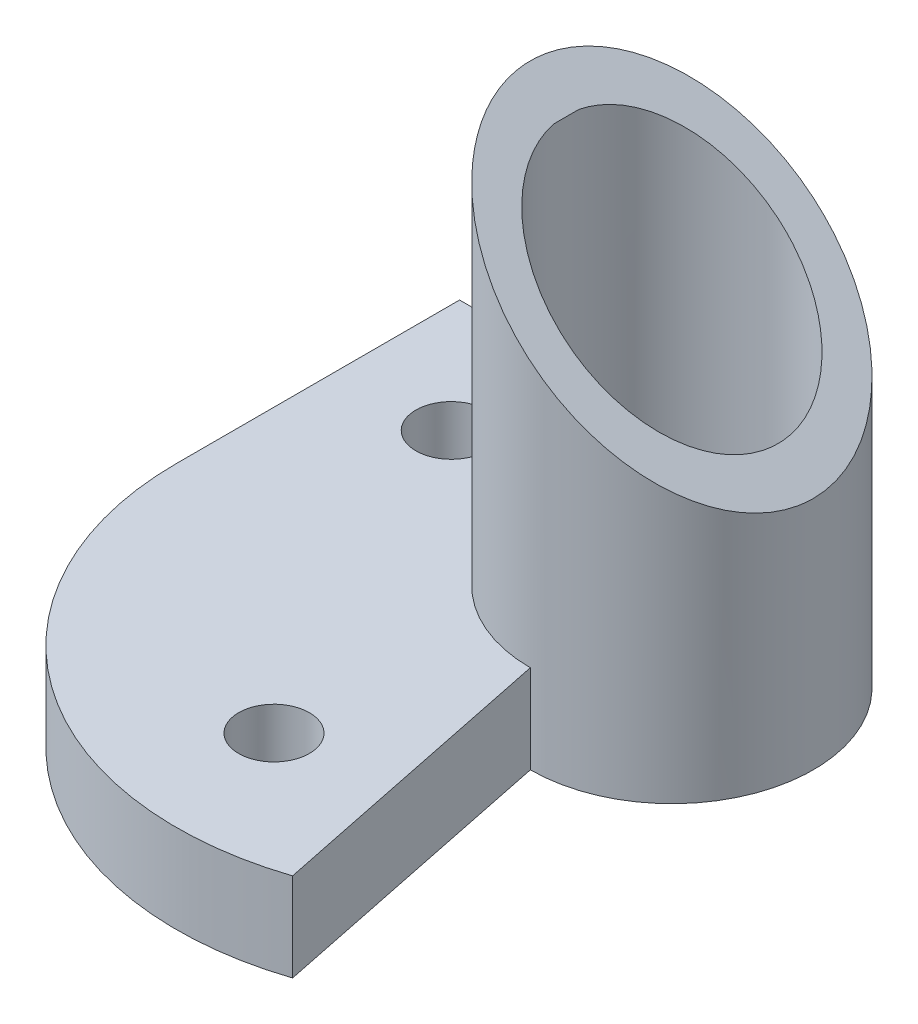
ISO-10303-21;
HEADER;
FILE_DESCRIPTION(('STEP AP214'),'2;1');
FILE_NAME('part.step','',(''),(''),'','','');
FILE_SCHEMA(('AUTOMOTIVE_DESIGN { 1 0 10303 214 1 1 1 1 }'));
ENDSEC;
DATA;
#1=APPLICATION_CONTEXT('core data for automotive mechanical design processes');
#2=APPLICATION_PROTOCOL_DEFINITION('international standard','automotive_design',2000,#1);
#3=PRODUCT_CONTEXT('',#1,'mechanical');
#4=PRODUCT('Part','Part','',(#3));
#5=PRODUCT_RELATED_PRODUCT_CATEGORY('part','',(#4));
#6=PRODUCT_DEFINITION_FORMATION('','',#4);
#7=PRODUCT_DEFINITION_CONTEXT('part definition',#1,'design');
#8=PRODUCT_DEFINITION('design','',#6,#7);
#9=PRODUCT_DEFINITION_SHAPE('','',#8);
#10=(LENGTH_UNIT() NAMED_UNIT(*) SI_UNIT(.MILLI.,.METRE.));
#11=(NAMED_UNIT(*) PLANE_ANGLE_UNIT() SI_UNIT($,.RADIAN.));
#12=(NAMED_UNIT(*) SI_UNIT($,.STERADIAN.) SOLID_ANGLE_UNIT());
#13=UNCERTAINTY_MEASURE_WITH_UNIT(LENGTH_MEASURE(1.E-05),#10,'distance_accuracy_value','');
#14=(GEOMETRIC_REPRESENTATION_CONTEXT(3) GLOBAL_UNCERTAINTY_ASSIGNED_CONTEXT((#13)) GLOBAL_UNIT_ASSIGNED_CONTEXT((#10,
#11,#12)) REPRESENTATION_CONTEXT('',''));
#15=CARTESIAN_POINT('',(0.,0.,0.));
#16=DIRECTION('',(0.,0.,1.));
#17=DIRECTION('',(1.,0.,0.));
#18=AXIS2_PLACEMENT_3D('',#15,#16,#17);
#19=CARTESIAN_POINT('',(0.,30.,0.));
#20=DIRECTION('',(0.,-1.,0.));
#21=DIRECTION('',(0.,0.,-1.));
#22=AXIS2_PLACEMENT_3D('',#19,#20,#21);
#23=CYLINDRICAL_SURFACE('',#22,8.);
#24=CARTESIAN_POINT('',(0.,0.,0.));
#25=DIRECTION('',(0.642787609686541,0.766044443118977,0.));
#26=DIRECTION('',(0.766044443118977,-0.64278760968654,0.));
#27=AXIS2_PLACEMENT_3D('',#24,#25,#26);
#28=ELLIPSE('',#27,10.4432583146582,8.);
#29=CARTESIAN_POINT('',(8.,-6.71279704941826,0.));
#30=VERTEX_POINT('',#29);
#31=EDGE_CURVE('E154',#30,#30,#28,.T.);
#32=ORIENTED_EDGE('',*,*,#31,.F.);
#33=EDGE_LOOP('',(#32));
#34=FACE_BOUND('',#33,.T.);
#35=DIRECTION('',(0.,-1.,0.));
#36=VECTOR('',#35,1.);
#37=CARTESIAN_POINT('',(0.,-15.,-8.));
#38=LINE('',#37,#36);
#39=CARTESIAN_POINT('',(0.,-15.,-8.));
#40=VERTEX_POINT('',#39);
#41=CARTESIAN_POINT('',(0.,-20.,-8.));
#42=VERTEX_POINT('',#41);
#43=EDGE_CURVE('E54',#40,#42,#38,.T.);
#44=ORIENTED_EDGE('',*,*,#43,.F.);
#45=CARTESIAN_POINT('',(0.,-15.,0.));
#46=DIRECTION('',(0.,-1.,0.));
#47=DIRECTION('',(0.,0.,-1.));
#48=AXIS2_PLACEMENT_3D('',#45,#46,#47);
#49=CIRCLE('',#48,8.);
#50=CARTESIAN_POINT('',(0.,-15.,8.));
#51=VERTEX_POINT('',#50);
#52=EDGE_CURVE('E59',#51,#40,#49,.T.);
#53=ORIENTED_EDGE('',*,*,#52,.F.);
#54=DIRECTION('',(0.,-1.,0.));
#55=VECTOR('',#54,1.);
#56=CARTESIAN_POINT('',(0.,-15.,8.));
#57=LINE('',#56,#55);
#58=CARTESIAN_POINT('',(0.,-20.,8.));
#59=VERTEX_POINT('',#58);
#60=EDGE_CURVE('E112',#51,#59,#57,.T.);
#61=ORIENTED_EDGE('',*,*,#60,.T.);
#62=CARTESIAN_POINT('',(0.,-20.,0.));
#63=DIRECTION('',(0.,1.,0.));
#64=DIRECTION('',(0.,0.,1.));
#65=AXIS2_PLACEMENT_3D('',#62,#63,#64);
#66=CIRCLE('',#65,8.);
#67=EDGE_CURVE('E152',#59,#42,#66,.T.);
#68=ORIENTED_EDGE('',*,*,#67,.T.);
#69=EDGE_LOOP('',(#44,#53,#61,#68));
#70=FACE_BOUND('',#69,.T.);
#71=ADVANCED_FACE('F40',(#34,#70),#23,.T.);
#72=CARTESIAN_POINT('',(0.,0.,0.));
#73=DIRECTION('',(0.642787609686541,0.766044443118977,0.));
#74=DIRECTION('',(-0.766044443118977,0.64278760968654,0.));
#75=AXIS2_PLACEMENT_3D('',#72,#73,#74);
#76=PLANE('',#75);
#77=ORIENTED_EDGE('',*,*,#31,.T.);
#78=EDGE_LOOP('',(#77));
#79=FACE_BOUND('',#78,.T.);
#80=CARTESIAN_POINT('',(0.,0.,0.));
#81=DIRECTION('',(0.642787609686541,0.766044443118977,0.));
#82=DIRECTION('',(0.766044443118977,-0.64278760968654,0.));
#83=AXIS2_PLACEMENT_3D('',#80,#81,#82);
#84=ELLIPSE('',#83,7.83244373599368,6.);
#85=CARTESIAN_POINT('',(-5.95876796297101,4.99999999999998,0.702199660688006));
#86=VERTEX_POINT('',#85);
#87=CARTESIAN_POINT('',(-5.95876796297101,4.99999999999998,-0.702199660687965));
#88=VERTEX_POINT('',#87);
#89=EDGE_CURVE('E47',#86,#88,#84,.T.);
#90=ORIENTED_EDGE('',*,*,#89,.F.);
#91=DIRECTION('',(0.,0.,1.));
#92=VECTOR('',#91,1.);
#93=CARTESIAN_POINT('',(-5.95876796297101,4.99999999999998,0.));
#94=LINE('',#93,#92);
#95=EDGE_CURVE('E13',#88,#86,#94,.T.);
#96=ORIENTED_EDGE('',*,*,#95,.F.);
#97=EDGE_LOOP('',(#90,#96));
#98=FACE_BOUND('',#97,.T.);
#99=ADVANCED_FACE('F166',(#79,#98),#76,.T.);
#100=CARTESIAN_POINT('',(0.,-20.,0.));
#101=DIRECTION('',(0.,1.,0.));
#102=DIRECTION('',(0.,0.,1.));
#103=AXIS2_PLACEMENT_3D('',#100,#101,#102);
#104=PLANE('',#103);
#105=CARTESIAN_POINT('',(0.,-20.,0.));
#106=DIRECTION('',(0.,-1.,0.));
#107=DIRECTION('',(0.,0.,-1.));
#108=AXIS2_PLACEMENT_3D('',#105,#106,#107);
#109=CIRCLE('',#108,6.);
#110=CARTESIAN_POINT('',(0.,-20.,-6.));
#111=VERTEX_POINT('',#110);
#112=EDGE_CURVE('E149',#111,#111,#109,.T.);
#113=ORIENTED_EDGE('',*,*,#112,.F.);
#114=EDGE_LOOP('',(#113));
#115=FACE_BOUND('',#114,.T.);
#116=ORIENTED_EDGE('',*,*,#67,.F.);
#117=DIRECTION('',(-0.200934070603872,0.,-0.979604766868025));
#118=VECTOR('',#117,1.);
#119=CARTESIAN_POINT('',(-1.57468778711799,-20.,0.322996005835533));
#120=LINE('',#119,#118);
#121=CARTESIAN_POINT('',(3.46810253358465,-20.,24.9078830866085));
#122=VERTEX_POINT('',#121);
#123=EDGE_CURVE('E129',#122,#59,#120,.T.);
#124=ORIENTED_EDGE('',*,*,#123,.F.);
#125=CARTESIAN_POINT('',(-2.17520257975725,-20.,8.));
#126=DIRECTION('',(0.,-1.,0.));
#127=DIRECTION('',(0.,0.,-1.));
#128=AXIS2_PLACEMENT_3D('',#125,#126,#127);
#129=CIRCLE('',#128,17.8247974202427);
#130=CARTESIAN_POINT('',(-20.,-20.,8.));
#131=VERTEX_POINT('',#130);
#132=EDGE_CURVE('E107',#131,#122,#129,.F.);
#133=ORIENTED_EDGE('',*,*,#132,.F.);
#134=DIRECTION('',(0.,0.,-1.));
#135=VECTOR('',#134,1.);
#136=CARTESIAN_POINT('',(-20.,-20.,0.));
#137=LINE('',#136,#135);
#138=CARTESIAN_POINT('',(-20.,-20.,-8.));
#139=VERTEX_POINT('',#138);
#140=EDGE_CURVE('E132',#131,#139,#137,.T.);
#141=ORIENTED_EDGE('',*,*,#140,.T.);
#142=DIRECTION('',(-1.,0.,0.));
#143=VECTOR('',#142,1.);
#144=CARTESIAN_POINT('',(0.,-20.,-8.));
#145=LINE('',#144,#143);
#146=EDGE_CURVE('E135',#42,#139,#145,.T.);
#147=ORIENTED_EDGE('',*,*,#146,.F.);
#148=EDGE_LOOP('',(#116,#124,#133,#141,#147));
#149=FACE_BOUND('',#148,.T.);
#150=CARTESIAN_POINT('',(-13.8510365706695,-20.,-1.37921930106953));
#151=DIRECTION('',(0.,-1.,0.));
#152=DIRECTION('',(0.,0.,-1.));
#153=AXIS2_PLACEMENT_3D('',#150,#151,#152);
#154=CIRCLE('',#153,2.);
#155=CARTESIAN_POINT('',(-13.8510365706695,-20.,-3.37921930106953));
#156=VERTEX_POINT('',#155);
#157=EDGE_CURVE('E126',#156,#156,#154,.T.);
#158=ORIENTED_EDGE('',*,*,#157,.F.);
#159=EDGE_LOOP('',(#158));
#160=FACE_BOUND('',#159,.T.);
#161=CARTESIAN_POINT('',(-4.04532645237533,-20.,18.4434255377461));
#162=DIRECTION('',(0.,-1.,0.));
#163=DIRECTION('',(0.,0.,-1.));
#164=AXIS2_PLACEMENT_3D('',#161,#162,#163);
#165=CIRCLE('',#164,2.);
#166=CARTESIAN_POINT('',(-4.04532645237533,-20.,16.4434255377461));
#167=VERTEX_POINT('',#166);
#168=EDGE_CURVE('E138',#167,#167,#165,.T.);
#169=ORIENTED_EDGE('',*,*,#168,.F.);
#170=EDGE_LOOP('',(#169));
#171=FACE_BOUND('',#170,.T.);
#172=ADVANCED_FACE('F168',(#115,#149,#160,#171),#104,.F.);
#173=CARTESIAN_POINT('',(0.,0.,0.));
#174=DIRECTION('',(0.,-1.,0.));
#175=DIRECTION('',(0.,0.,-1.));
#176=AXIS2_PLACEMENT_3D('',#173,#174,#175);
#177=CYLINDRICAL_SURFACE('',#176,6.);
#178=ORIENTED_EDGE('',*,*,#89,.T.);
#179=CARTESIAN_POINT('',(0.,4.99999999999998,0.));
#180=DIRECTION('',(0.,1.,0.));
#181=DIRECTION('',(0.,0.,1.));
#182=AXIS2_PLACEMENT_3D('',#179,#180,#181);
#183=CIRCLE('',#182,6.);
#184=EDGE_CURVE('E142',#88,#86,#183,.T.);
#185=ORIENTED_EDGE('',*,*,#184,.T.);
#186=EDGE_LOOP('',(#178,#185));
#187=FACE_BOUND('',#186,.T.);
#188=ORIENTED_EDGE('',*,*,#112,.T.);
#189=EDGE_LOOP('',(#188));
#190=FACE_BOUND('',#189,.T.);
#191=ADVANCED_FACE('F160',(#187,#190),#177,.F.);
#192=CARTESIAN_POINT('',(0.,4.99999999999998,0.));
#193=DIRECTION('',(0.,1.,0.));
#194=DIRECTION('',(0.,0.,1.));
#195=AXIS2_PLACEMENT_3D('',#192,#193,#194);
#196=PLANE('',#195);
#197=ORIENTED_EDGE('',*,*,#95,.T.);
#198=ORIENTED_EDGE('',*,*,#184,.F.);
#199=EDGE_LOOP('',(#197,#198));
#200=FACE_BOUND('',#199,.T.);
#201=ADVANCED_FACE('F165',(#200),#196,.F.);
#202=CARTESIAN_POINT('',(0.,-15.,-8.));
#203=DIRECTION('',(0.,0.,1.));
#204=DIRECTION('',(1.,0.,0.));
#205=AXIS2_PLACEMENT_3D('',#202,#203,#204);
#206=PLANE('',#205);
#207=ORIENTED_EDGE('',*,*,#146,.T.);
#208=DIRECTION('',(0.,-1.,0.));
#209=VECTOR('',#208,1.);
#210=CARTESIAN_POINT('',(-20.,-15.,-8.));
#211=LINE('',#210,#209);
#212=CARTESIAN_POINT('',(-20.,-15.,-8.));
#213=VERTEX_POINT('',#212);
#214=EDGE_CURVE('E143',#213,#139,#211,.T.);
#215=ORIENTED_EDGE('',*,*,#214,.F.);
#216=DIRECTION('',(-1.,0.,0.));
#217=VECTOR('',#216,1.);
#218=CARTESIAN_POINT('',(0.,-15.,-8.));
#219=LINE('',#218,#217);
#220=EDGE_CURVE('E121',#40,#213,#219,.T.);
#221=ORIENTED_EDGE('',*,*,#220,.F.);
#222=ORIENTED_EDGE('',*,*,#43,.T.);
#223=EDGE_LOOP('',(#207,#215,#221,#222));
#224=FACE_BOUND('',#223,.T.);
#225=ADVANCED_FACE('F182',(#224),#206,.F.);
#226=CARTESIAN_POINT('',(-20.,-15.,0.));
#227=DIRECTION('',(-1.,0.,0.));
#228=DIRECTION('',(0.,0.,1.));
#229=AXIS2_PLACEMENT_3D('',#226,#227,#228);
#230=PLANE('',#229);
#231=ORIENTED_EDGE('',*,*,#140,.F.);
#232=DIRECTION('',(0.,-1.,0.));
#233=VECTOR('',#232,1.);
#234=CARTESIAN_POINT('',(-20.,-15.,8.));
#235=LINE('',#234,#233);
#236=CARTESIAN_POINT('',(-20.,-15.,8.));
#237=VERTEX_POINT('',#236);
#238=EDGE_CURVE('E111',#237,#131,#235,.T.);
#239=ORIENTED_EDGE('',*,*,#238,.F.);
#240=DIRECTION('',(0.,0.,-1.));
#241=VECTOR('',#240,1.);
#242=CARTESIAN_POINT('',(-20.,-15.,0.));
#243=LINE('',#242,#241);
#244=EDGE_CURVE('E100',#237,#213,#243,.T.);
#245=ORIENTED_EDGE('',*,*,#244,.T.);
#246=ORIENTED_EDGE('',*,*,#214,.T.);
#247=EDGE_LOOP('',(#231,#239,#245,#246));
#248=FACE_BOUND('',#247,.T.);
#249=ADVANCED_FACE('F192',(#248),#230,.T.);
#250=CARTESIAN_POINT('',(-2.17520257975725,-15.,8.));
#251=DIRECTION('',(0.,-1.,0.));
#252=DIRECTION('',(0.,0.,-1.));
#253=AXIS2_PLACEMENT_3D('',#250,#251,#252);
#254=CYLINDRICAL_SURFACE('',#253,17.8247974202427);
#255=ORIENTED_EDGE('',*,*,#132,.T.);
#256=DIRECTION('',(0.,-1.,0.));
#257=VECTOR('',#256,1.);
#258=CARTESIAN_POINT('',(3.46810253358465,-15.,24.9078830866085));
#259=LINE('',#258,#257);
#260=CARTESIAN_POINT('',(3.46810253358465,-15.,24.9078830866085));
#261=VERTEX_POINT('',#260);
#262=EDGE_CURVE('E104',#261,#122,#259,.T.);
#263=ORIENTED_EDGE('',*,*,#262,.F.);
#264=CARTESIAN_POINT('',(-2.17520257975725,-15.,8.));
#265=DIRECTION('',(0.,-1.,0.));
#266=DIRECTION('',(0.,0.,-1.));
#267=AXIS2_PLACEMENT_3D('',#264,#265,#266);
#268=CIRCLE('',#267,17.8247974202427);
#269=EDGE_CURVE('E92',#237,#261,#268,.F.);
#270=ORIENTED_EDGE('',*,*,#269,.F.);
#271=ORIENTED_EDGE('',*,*,#238,.T.);
#272=EDGE_LOOP('',(#255,#263,#270,#271));
#273=FACE_BOUND('',#272,.T.);
#274=ADVANCED_FACE('F105',(#273),#254,.T.);
#275=CARTESIAN_POINT('',(-1.57468778711799,-15.,0.322996005835533));
#276=DIRECTION('',(-0.979604766868025,0.,0.200934070603872));
#277=DIRECTION('',(0.200934070603872,0.,0.979604766868025));
#278=AXIS2_PLACEMENT_3D('',#275,#276,#277);
#279=PLANE('',#278);
#280=ORIENTED_EDGE('',*,*,#123,.T.);
#281=ORIENTED_EDGE('',*,*,#60,.F.);
#282=DIRECTION('',(-0.200934070603872,0.,-0.979604766868025));
#283=VECTOR('',#282,1.);
#284=CARTESIAN_POINT('',(-1.57468778711799,-15.,0.322996005835533));
#285=LINE('',#284,#283);
#286=EDGE_CURVE('E97',#261,#51,#285,.T.);
#287=ORIENTED_EDGE('',*,*,#286,.F.);
#288=ORIENTED_EDGE('',*,*,#262,.T.);
#289=EDGE_LOOP('',(#280,#281,#287,#288));
#290=FACE_BOUND('',#289,.T.);
#291=ADVANCED_FACE('F114',(#290),#279,.F.);
#292=CARTESIAN_POINT('',(-13.8510365706695,-15.,-1.37921930106953));
#293=DIRECTION('',(0.,-1.,0.));
#294=DIRECTION('',(0.,0.,-1.));
#295=AXIS2_PLACEMENT_3D('',#292,#293,#294);
#296=CYLINDRICAL_SURFACE('',#295,2.);
#297=CARTESIAN_POINT('',(-13.8510365706695,-15.,-1.37921930106953));
#298=DIRECTION('',(0.,-1.,0.));
#299=DIRECTION('',(0.,0.,-1.));
#300=AXIS2_PLACEMENT_3D('',#297,#298,#299);
#301=CIRCLE('',#300,2.);
#302=CARTESIAN_POINT('',(-13.8510365706695,-15.,-3.37921930106953));
#303=VERTEX_POINT('',#302);
#304=EDGE_CURVE('E116',#303,#303,#301,.T.);
#305=ORIENTED_EDGE('',*,*,#304,.F.);
#306=EDGE_LOOP('',(#305));
#307=FACE_BOUND('',#306,.T.);
#308=ORIENTED_EDGE('',*,*,#157,.T.);
#309=EDGE_LOOP('',(#308));
#310=FACE_BOUND('',#309,.T.);
#311=ADVANCED_FACE('F183',(#307,#310),#296,.F.);
#312=CARTESIAN_POINT('',(-4.04532645237533,-15.,18.4434255377461));
#313=DIRECTION('',(0.,-1.,0.));
#314=DIRECTION('',(0.,0.,-1.));
#315=AXIS2_PLACEMENT_3D('',#312,#313,#314);
#316=CYLINDRICAL_SURFACE('',#315,2.);
#317=CARTESIAN_POINT('',(-4.04532645237533,-15.,18.4434255377461));
#318=DIRECTION('',(0.,-1.,0.));
#319=DIRECTION('',(0.,0.,-1.));
#320=AXIS2_PLACEMENT_3D('',#317,#318,#319);
#321=CIRCLE('',#320,2.);
#322=CARTESIAN_POINT('',(-4.04532645237533,-15.,16.4434255377461));
#323=VERTEX_POINT('',#322);
#324=EDGE_CURVE('E123',#323,#323,#321,.T.);
#325=ORIENTED_EDGE('',*,*,#324,.F.);
#326=EDGE_LOOP('',(#325));
#327=FACE_BOUND('',#326,.T.);
#328=ORIENTED_EDGE('',*,*,#168,.T.);
#329=EDGE_LOOP('',(#328));
#330=FACE_BOUND('',#329,.T.);
#331=ADVANCED_FACE('F186',(#327,#330),#316,.F.);
#332=CARTESIAN_POINT('',(0.,-15.,0.));
#333=DIRECTION('',(0.,-1.,0.));
#334=DIRECTION('',(0.,0.,-1.));
#335=AXIS2_PLACEMENT_3D('',#332,#333,#334);
#336=PLANE('',#335);
#337=ORIENTED_EDGE('',*,*,#304,.T.);
#338=EDGE_LOOP('',(#337));
#339=FACE_BOUND('',#338,.T.);
#340=ORIENTED_EDGE('',*,*,#52,.T.);
#341=ORIENTED_EDGE('',*,*,#220,.T.);
#342=ORIENTED_EDGE('',*,*,#244,.F.);
#343=ORIENTED_EDGE('',*,*,#269,.T.);
#344=ORIENTED_EDGE('',*,*,#286,.T.);
#345=EDGE_LOOP('',(#340,#341,#342,#343,#344));
#346=FACE_BOUND('',#345,.T.);
#347=ORIENTED_EDGE('',*,*,#324,.T.);
#348=EDGE_LOOP('',(#347));
#349=FACE_BOUND('',#348,.T.);
#350=ADVANCED_FACE('F94',(#339,#346,#349),#336,.F.);
#351=CLOSED_SHELL('',(#71,#99,#172,#191,#201,#225,#249,#274,#291,#311,#331,#350));
#352=MANIFOLD_SOLID_BREP('B2',#351);
#353=ADVANCED_BREP_SHAPE_REPRESENTATION('',(#18,#352),#14);
#354=SHAPE_DEFINITION_REPRESENTATION(#9,#353);
ENDSEC;
END-ISO-10303-21;
